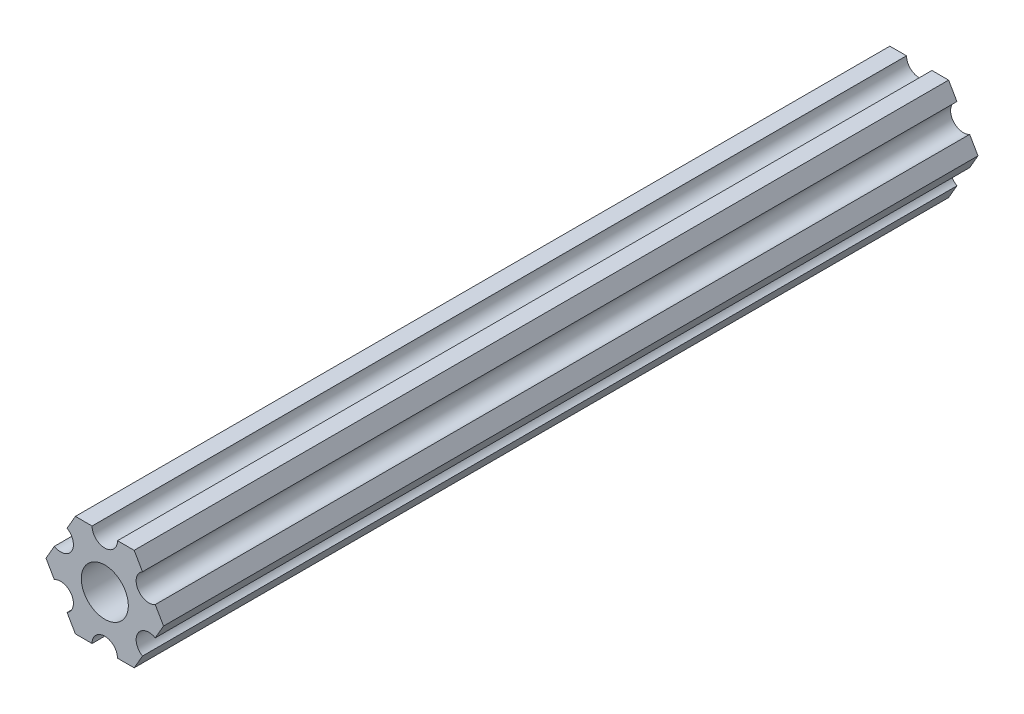
ISO-10303-21;
HEADER;
FILE_DESCRIPTION(('STEP AP214'),'2;1');
FILE_NAME('part.step','',(''),(''),'','','');
FILE_SCHEMA(('AUTOMOTIVE_DESIGN { 1 0 10303 214 1 1 1 1 }'));
ENDSEC;
DATA;
#1=APPLICATION_CONTEXT('core data for automotive mechanical design processes');
#2=APPLICATION_PROTOCOL_DEFINITION('international standard','automotive_design',2000,#1);
#3=PRODUCT_CONTEXT('',#1,'mechanical');
#4=PRODUCT('Part','Part','',(#3));
#5=PRODUCT_RELATED_PRODUCT_CATEGORY('part','',(#4));
#6=PRODUCT_DEFINITION_FORMATION('','',#4);
#7=PRODUCT_DEFINITION_CONTEXT('part definition',#1,'design');
#8=PRODUCT_DEFINITION('design','',#6,#7);
#9=PRODUCT_DEFINITION_SHAPE('','',#8);
#10=(LENGTH_UNIT() NAMED_UNIT(*) SI_UNIT(.MILLI.,.METRE.));
#11=(NAMED_UNIT(*) PLANE_ANGLE_UNIT() SI_UNIT($,.RADIAN.));
#12=(NAMED_UNIT(*) SI_UNIT($,.STERADIAN.) SOLID_ANGLE_UNIT());
#13=UNCERTAINTY_MEASURE_WITH_UNIT(LENGTH_MEASURE(1.E-05),#10,'distance_accuracy_value','');
#14=(GEOMETRIC_REPRESENTATION_CONTEXT(3) GLOBAL_UNCERTAINTY_ASSIGNED_CONTEXT((#13)) GLOBAL_UNIT_ASSIGNED_CONTEXT((#10,
#11,#12)) REPRESENTATION_CONTEXT('',''));
#15=CARTESIAN_POINT('',(0.,0.,0.));
#16=DIRECTION('',(0.,0.,1.));
#17=DIRECTION('',(1.,0.,0.));
#18=AXIS2_PLACEMENT_3D('',#15,#16,#17);
#19=CARTESIAN_POINT('',(5.49926169873049,-3.17500022210629,203.2));
#20=DIRECTION('',(0.,0.,1.));
#21=DIRECTION('',(1.,0.,0.));
#22=AXIS2_PLACEMENT_3D('',#19,#20,#21);
#23=CYLINDRICAL_SURFACE('',#22,1.5875);
#24=CARTESIAN_POINT('',(5.49926169873049,-3.17500022210629,304.8));
#25=DIRECTION('',(0.,0.,-1.));
#26=DIRECTION('',(-1.,0.,0.));
#27=AXIS2_PLACEMENT_3D('',#24,#25,#26);
#28=CIRCLE('',#27,1.5875);
#29=CARTESIAN_POINT('',(4.7055116987305,-4.5498155506141,304.8));
#30=VERTEX_POINT('',#29);
#31=CARTESIAN_POINT('',(6.29301169873047,-1.80018489359848,304.8));
#32=VERTEX_POINT('',#31);
#33=EDGE_CURVE('E190',#30,#32,#28,.T.);
#34=ORIENTED_EDGE('',*,*,#33,.F.);
#35=DIRECTION('',(0.,0.,1.));
#36=VECTOR('',#35,1.);
#37=CARTESIAN_POINT('',(4.7055116987305,-4.5498155506141,203.2));
#38=LINE('',#37,#36);
#39=CARTESIAN_POINT('',(4.7055116987305,-4.5498155506141,203.2));
#40=VERTEX_POINT('',#39);
#41=EDGE_CURVE('E11',#40,#30,#38,.T.);
#42=ORIENTED_EDGE('',*,*,#41,.F.);
#43=CARTESIAN_POINT('',(5.49926169873049,-3.17500022210629,203.2));
#44=DIRECTION('',(0.,0.,-1.));
#45=DIRECTION('',(-1.,0.,0.));
#46=AXIS2_PLACEMENT_3D('',#43,#44,#45);
#47=CIRCLE('',#46,1.5875);
#48=CARTESIAN_POINT('',(6.29301169873047,-1.80018489359848,203.2));
#49=VERTEX_POINT('',#48);
#50=EDGE_CURVE('E241',#40,#49,#47,.T.);
#51=ORIENTED_EDGE('',*,*,#50,.T.);
#52=DIRECTION('',(0.,0.,1.));
#53=VECTOR('',#52,1.);
#54=CARTESIAN_POINT('',(6.29301169873047,-1.80018489359848,203.2));
#55=LINE('',#54,#53);
#56=EDGE_CURVE('E36',#49,#32,#55,.T.);
#57=ORIENTED_EDGE('',*,*,#56,.T.);
#58=EDGE_LOOP('',(#34,#42,#51,#57));
#59=FACE_BOUND('',#58,.T.);
#60=ADVANCED_FACE('F33',(#59),#23,.F.);
#61=CARTESIAN_POINT('',(3.6661745940535,-6.35000022210627,203.2));
#62=DIRECTION('',(0.866025403784446,-0.499999999999988,0.));
#63=DIRECTION('',(0.499999999999988,0.866025403784446,0.));
#64=AXIS2_PLACEMENT_3D('',#61,#62,#63);
#65=PLANE('',#64);
#66=DIRECTION('',(0.499999999999988,0.866025403784446,0.));
#67=VECTOR('',#66,1.);
#68=CARTESIAN_POINT('',(3.6661745940535,-6.35000022210627,304.8));
#69=LINE('',#68,#67);
#70=CARTESIAN_POINT('',(3.6661745940535,-6.35000022210627,304.8));
#71=VERTEX_POINT('',#70);
#72=EDGE_CURVE('E239',#71,#30,#69,.T.);
#73=ORIENTED_EDGE('',*,*,#72,.F.);
#74=DIRECTION('',(0.,0.,1.));
#75=VECTOR('',#74,1.);
#76=CARTESIAN_POINT('',(3.6661745940535,-6.35000022210627,203.2));
#77=LINE('',#76,#75);
#78=CARTESIAN_POINT('',(3.6661745940535,-6.35000022210627,203.2));
#79=VERTEX_POINT('',#78);
#80=EDGE_CURVE('E42',#79,#71,#77,.T.);
#81=ORIENTED_EDGE('',*,*,#80,.F.);
#82=DIRECTION('',(0.499999999999988,0.866025403784446,0.));
#83=VECTOR('',#82,1.);
#84=CARTESIAN_POINT('',(3.6661745940535,-6.35000022210627,203.2));
#85=LINE('',#84,#83);
#86=EDGE_CURVE('E180',#79,#40,#85,.T.);
#87=ORIENTED_EDGE('',*,*,#86,.T.);
#88=ORIENTED_EDGE('',*,*,#41,.T.);
#89=EDGE_LOOP('',(#73,#81,#87,#88));
#90=FACE_BOUND('',#89,.T.);
#91=ADVANCED_FACE('F273',(#90),#65,.T.);
#92=CARTESIAN_POINT('',(1.58750038469929,-6.35000022210627,203.2));
#93=DIRECTION('',(0.,-1.,0.));
#94=DIRECTION('',(0.,0.,-1.));
#95=AXIS2_PLACEMENT_3D('',#92,#93,#94);
#96=PLANE('',#95);
#97=DIRECTION('',(1.,0.,0.));
#98=VECTOR('',#97,1.);
#99=CARTESIAN_POINT('',(1.58750038469929,-6.35000022210627,304.8));
#100=LINE('',#99,#98);
#101=CARTESIAN_POINT('',(1.58750038469929,-6.35000022210627,304.8));
#102=VERTEX_POINT('',#101);
#103=EDGE_CURVE('E167',#102,#71,#100,.T.);
#104=ORIENTED_EDGE('',*,*,#103,.F.);
#105=DIRECTION('',(0.,0.,1.));
#106=VECTOR('',#105,1.);
#107=CARTESIAN_POINT('',(1.58750038469929,-6.35000022210627,203.2));
#108=LINE('',#107,#106);
#109=CARTESIAN_POINT('',(1.58750038469929,-6.35000022210627,203.2));
#110=VERTEX_POINT('',#109);
#111=EDGE_CURVE('E162',#110,#102,#108,.T.);
#112=ORIENTED_EDGE('',*,*,#111,.F.);
#113=DIRECTION('',(1.,0.,0.));
#114=VECTOR('',#113,1.);
#115=CARTESIAN_POINT('',(1.58750038469929,-6.35000022210627,203.2));
#116=LINE('',#115,#114);
#117=EDGE_CURVE('E165',#110,#79,#116,.T.);
#118=ORIENTED_EDGE('',*,*,#117,.T.);
#119=ORIENTED_EDGE('',*,*,#80,.T.);
#120=EDGE_LOOP('',(#104,#112,#118,#119));
#121=FACE_BOUND('',#120,.T.);
#122=ADVANCED_FACE('F164',(#121),#96,.T.);
#123=CARTESIAN_POINT('',(3.84699290671026E-07,-6.35000022210627,203.2));
#124=DIRECTION('',(0.,0.,1.));
#125=DIRECTION('',(1.,0.,0.));
#126=AXIS2_PLACEMENT_3D('',#123,#124,#125);
#127=CYLINDRICAL_SURFACE('',#126,1.5875);
#128=CARTESIAN_POINT('',(3.84699290671026E-07,-6.35000022210627,304.8));
#129=DIRECTION('',(0.,0.,-1.));
#130=DIRECTION('',(-1.,0.,0.));
#131=AXIS2_PLACEMENT_3D('',#128,#129,#130);
#132=CIRCLE('',#131,1.5875);
#133=CARTESIAN_POINT('',(-1.58749961530071,-6.35000022210627,304.8));
#134=VERTEX_POINT('',#133);
#135=EDGE_CURVE('E236',#134,#102,#132,.T.);
#136=ORIENTED_EDGE('',*,*,#135,.F.);
#137=DIRECTION('',(0.,0.,1.));
#138=VECTOR('',#137,1.);
#139=CARTESIAN_POINT('',(-1.58749961530071,-6.35000022210627,203.2));
#140=LINE('',#139,#138);
#141=CARTESIAN_POINT('',(-1.58749961530071,-6.35000022210627,203.2));
#142=VERTEX_POINT('',#141);
#143=EDGE_CURVE('E172',#142,#134,#140,.T.);
#144=ORIENTED_EDGE('',*,*,#143,.F.);
#145=CARTESIAN_POINT('',(3.84699290671026E-07,-6.35000022210627,203.2));
#146=DIRECTION('',(0.,0.,-1.));
#147=DIRECTION('',(-1.,0.,0.));
#148=AXIS2_PLACEMENT_3D('',#145,#146,#147);
#149=CIRCLE('',#148,1.5875);
#150=EDGE_CURVE('E178',#142,#110,#149,.T.);
#151=ORIENTED_EDGE('',*,*,#150,.T.);
#152=ORIENTED_EDGE('',*,*,#111,.T.);
#153=EDGE_LOOP('',(#136,#144,#151,#152));
#154=FACE_BOUND('',#153,.T.);
#155=ADVANCED_FACE('F182',(#154),#127,.F.);
#156=CARTESIAN_POINT('',(-3.66617382465478,-6.35000022210627,203.2));
#157=DIRECTION('',(0.,-1.,0.));
#158=DIRECTION('',(1.,0.,0.));
#159=AXIS2_PLACEMENT_3D('',#156,#157,#158);
#160=PLANE('',#159);
#161=DIRECTION('',(1.,0.,0.));
#162=VECTOR('',#161,1.);
#163=CARTESIAN_POINT('',(-3.66617382465478,-6.35000022210627,304.8));
#164=LINE('',#163,#162);
#165=CARTESIAN_POINT('',(-3.66617382465478,-6.35000022210627,304.8));
#166=VERTEX_POINT('',#165);
#167=EDGE_CURVE('E233',#166,#134,#164,.T.);
#168=ORIENTED_EDGE('',*,*,#167,.F.);
#169=DIRECTION('',(0.,0.,1.));
#170=VECTOR('',#169,1.);
#171=CARTESIAN_POINT('',(-3.66617382465478,-6.35000022210627,203.2));
#172=LINE('',#171,#170);
#173=CARTESIAN_POINT('',(-3.66617382465478,-6.35000022210627,203.2));
#174=VERTEX_POINT('',#173);
#175=EDGE_CURVE('E245',#174,#166,#172,.T.);
#176=ORIENTED_EDGE('',*,*,#175,.F.);
#177=DIRECTION('',(1.,0.,0.));
#178=VECTOR('',#177,1.);
#179=CARTESIAN_POINT('',(-3.66617382465478,-6.35000022210627,203.2));
#180=LINE('',#179,#178);
#181=EDGE_CURVE('E183',#174,#142,#180,.T.);
#182=ORIENTED_EDGE('',*,*,#181,.T.);
#183=ORIENTED_EDGE('',*,*,#143,.T.);
#184=EDGE_LOOP('',(#168,#176,#182,#183));
#185=FACE_BOUND('',#184,.T.);
#186=ADVANCED_FACE('F286',(#185),#160,.T.);
#187=CARTESIAN_POINT('',(-4.70551103839171,-4.54981561357971,203.2));
#188=DIRECTION('',(-0.866025373493149,-0.500000052466048,0.));
#189=DIRECTION('',(0.500000052466048,-0.866025373493149,0.));
#190=AXIS2_PLACEMENT_3D('',#187,#188,#189);
#191=PLANE('',#190);
#192=DIRECTION('',(0.500000052466048,-0.866025373493149,0.));
#193=VECTOR('',#192,1.);
#194=CARTESIAN_POINT('',(-4.70551103839171,-4.54981561357971,304.8));
#195=LINE('',#194,#193);
#196=CARTESIAN_POINT('',(-4.70551103839171,-4.54981561357971,304.8));
#197=VERTEX_POINT('',#196);
#198=EDGE_CURVE('E230',#197,#166,#195,.T.);
#199=ORIENTED_EDGE('',*,*,#198,.F.);
#200=DIRECTION('',(0.,0.,1.));
#201=VECTOR('',#200,1.);
#202=CARTESIAN_POINT('',(-4.70551103839171,-4.54981561357971,203.2));
#203=LINE('',#202,#201);
#204=CARTESIAN_POINT('',(-4.70551103839171,-4.54981561357971,203.2));
#205=VERTEX_POINT('',#204);
#206=EDGE_CURVE('E247',#205,#197,#203,.T.);
#207=ORIENTED_EDGE('',*,*,#206,.F.);
#208=DIRECTION('',(0.500000052466048,-0.866025373493149,0.));
#209=VECTOR('',#208,1.);
#210=CARTESIAN_POINT('',(-4.70551103839171,-4.54981561357971,203.2));
#211=LINE('',#210,#209);
#212=EDGE_CURVE('E185',#205,#174,#211,.T.);
#213=ORIENTED_EDGE('',*,*,#212,.T.);
#214=ORIENTED_EDGE('',*,*,#175,.T.);
#215=EDGE_LOOP('',(#199,#207,#213,#214));
#216=FACE_BOUND('',#215,.T.);
#217=ADVANCED_FACE('F289',(#216),#191,.T.);
#218=CARTESIAN_POINT('',(-5.49926112168156,-3.17500033315934,203.2));
#219=DIRECTION('',(0.,0.,1.));
#220=DIRECTION('',(1.,0.,0.));
#221=AXIS2_PLACEMENT_3D('',#218,#219,#220);
#222=CYLINDRICAL_SURFACE('',#221,1.5875);
#223=CARTESIAN_POINT('',(-5.49926112168156,-3.17500033315934,304.8));
#224=DIRECTION('',(0.,0.,-1.));
#225=DIRECTION('',(-1.,0.,0.));
#226=AXIS2_PLACEMENT_3D('',#223,#224,#225);
#227=CIRCLE('',#226,1.5875);
#228=CARTESIAN_POINT('',(-6.29301120497141,-1.80018505273897,304.8));
#229=VERTEX_POINT('',#228);
#230=EDGE_CURVE('E227',#229,#197,#227,.T.);
#231=ORIENTED_EDGE('',*,*,#230,.F.);
#232=DIRECTION('',(0.,0.,1.));
#233=VECTOR('',#232,1.);
#234=CARTESIAN_POINT('',(-6.29301120497141,-1.80018505273897,203.2));
#235=LINE('',#234,#233);
#236=CARTESIAN_POINT('',(-6.29301120497141,-1.80018505273897,203.2));
#237=VERTEX_POINT('',#236);
#238=EDGE_CURVE('E249',#237,#229,#235,.T.);
#239=ORIENTED_EDGE('',*,*,#238,.F.);
#240=CARTESIAN_POINT('',(-5.49926112168156,-3.17500033315934,203.2));
#241=DIRECTION('',(0.,0.,-1.));
#242=DIRECTION('',(-1.,0.,0.));
#243=AXIS2_PLACEMENT_3D('',#240,#241,#242);
#244=CIRCLE('',#243,1.5875);
#245=EDGE_CURVE('E394',#237,#205,#244,.T.);
#246=ORIENTED_EDGE('',*,*,#245,.T.);
#247=ORIENTED_EDGE('',*,*,#206,.T.);
#248=EDGE_LOOP('',(#231,#239,#246,#247));
#249=FACE_BOUND('',#248,.T.);
#250=ADVANCED_FACE('F293',(#249),#222,.F.);
#251=CARTESIAN_POINT('',(-7.33234841870827,-4.44212523790841E-07,203.2));
#252=DIRECTION('',(-0.866025373493149,-0.500000052466048,0.));
#253=DIRECTION('',(0.500000052466048,-0.866025373493149,0.));
#254=AXIS2_PLACEMENT_3D('',#251,#252,#253);
#255=PLANE('',#254);
#256=DIRECTION('',(0.500000052466048,-0.86602537349315,0.));
#257=VECTOR('',#256,1.);
#258=CARTESIAN_POINT('',(-7.33234841870827,-4.44212523790841E-07,304.8));
#259=LINE('',#258,#257);
#260=CARTESIAN_POINT('',(-7.33234841870827,-4.44212523790841E-07,304.8));
#261=VERTEX_POINT('',#260);
#262=EDGE_CURVE('E224',#261,#229,#259,.T.);
#263=ORIENTED_EDGE('',*,*,#262,.F.);
#264=DIRECTION('',(0.,0.,1.));
#265=VECTOR('',#264,1.);
#266=CARTESIAN_POINT('',(-7.33234841870827,-4.44212523790841E-07,203.2));
#267=LINE('',#266,#265);
#268=CARTESIAN_POINT('',(-7.33234841870827,-4.44212523790841E-07,203.2));
#269=VERTEX_POINT('',#268);
#270=EDGE_CURVE('E251',#269,#261,#267,.T.);
#271=ORIENTED_EDGE('',*,*,#270,.F.);
#272=DIRECTION('',(0.500000052466048,-0.86602537349315,0.));
#273=VECTOR('',#272,1.);
#274=CARTESIAN_POINT('',(-7.33234841870827,-4.44212523790841E-07,203.2));
#275=LINE('',#274,#273);
#276=EDGE_CURVE('E391',#269,#237,#275,.T.);
#277=ORIENTED_EDGE('',*,*,#276,.T.);
#278=ORIENTED_EDGE('',*,*,#238,.T.);
#279=EDGE_LOOP('',(#263,#271,#277,#278));
#280=FACE_BOUND('',#279,.T.);
#281=ADVANCED_FACE('F297',(#280),#255,.T.);
#282=CARTESIAN_POINT('',(-6.29301142309098,1.80018429024547,203.2));
#283=DIRECTION('',(-0.866025434075722,0.499999947533955,0.));
#284=DIRECTION('',(-0.499999947533955,-0.866025434075722,0.));
#285=AXIS2_PLACEMENT_3D('',#282,#283,#284);
#286=PLANE('',#285);
#287=DIRECTION('',(-0.499999947533955,-0.866025434075722,0.));
#288=VECTOR('',#287,1.);
#289=CARTESIAN_POINT('',(-6.29301142309098,1.80018429024547,304.8));
#290=LINE('',#289,#288);
#291=CARTESIAN_POINT('',(-6.29301142309098,1.80018429024546,304.8));
#292=VERTEX_POINT('',#291);
#293=EDGE_CURVE('E221',#292,#261,#290,.T.);
#294=ORIENTED_EDGE('',*,*,#293,.F.);
#295=DIRECTION('',(0.,0.,1.));
#296=VECTOR('',#295,1.);
#297=CARTESIAN_POINT('',(-6.29301142309098,1.80018429024546,203.2));
#298=LINE('',#297,#296);
#299=CARTESIAN_POINT('',(-6.29301142309098,1.80018429024546,203.2));
#300=VERTEX_POINT('',#299);
#301=EDGE_CURVE('E253',#300,#292,#298,.T.);
#302=ORIENTED_EDGE('',*,*,#301,.F.);
#303=DIRECTION('',(-0.499999947533955,-0.866025434075722,0.));
#304=VECTOR('',#303,1.);
#305=CARTESIAN_POINT('',(-6.29301142309098,1.80018429024547,203.2));
#306=LINE('',#305,#304);
#307=EDGE_CURVE('E388',#300,#269,#306,.T.);
#308=ORIENTED_EDGE('',*,*,#307,.T.);
#309=ORIENTED_EDGE('',*,*,#270,.T.);
#310=EDGE_LOOP('',(#294,#302,#308,#309));
#311=FACE_BOUND('',#310,.T.);
#312=ADVANCED_FACE('F301',(#311),#286,.T.);
#313=CARTESIAN_POINT('',(-5.49926150638083,3.17499966684067,203.2));
#314=DIRECTION('',(0.,0.,1.));
#315=DIRECTION('',(1.,0.,0.));
#316=AXIS2_PLACEMENT_3D('',#313,#314,#315);
#317=CYLINDRICAL_SURFACE('',#316,1.5875);
#318=CARTESIAN_POINT('',(-5.49926150638083,3.17499966684067,304.8));
#319=DIRECTION('',(0.,0.,-1.));
#320=DIRECTION('',(-1.,0.,0.));
#321=AXIS2_PLACEMENT_3D('',#318,#319,#320);
#322=CIRCLE('',#321,1.5875);
#323=CARTESIAN_POINT('',(-4.70551158967067,4.54981504343588,304.8));
#324=VERTEX_POINT('',#323);
#325=EDGE_CURVE('E218',#324,#292,#322,.T.);
#326=ORIENTED_EDGE('',*,*,#325,.F.);
#327=DIRECTION('',(0.,0.,1.));
#328=VECTOR('',#327,1.);
#329=CARTESIAN_POINT('',(-4.70551158967067,4.54981504343588,203.2));
#330=LINE('',#329,#328);
#331=CARTESIAN_POINT('',(-4.70551158967067,4.54981504343588,203.2));
#332=VERTEX_POINT('',#331);
#333=EDGE_CURVE('E255',#332,#324,#330,.T.);
#334=ORIENTED_EDGE('',*,*,#333,.F.);
#335=CARTESIAN_POINT('',(-5.49926150638083,3.17499966684067,203.2));
#336=DIRECTION('',(0.,0.,-1.));
#337=DIRECTION('',(-1.,0.,0.));
#338=AXIS2_PLACEMENT_3D('',#335,#336,#337);
#339=CIRCLE('',#338,1.5875);
#340=EDGE_CURVE('E385',#332,#300,#339,.T.);
#341=ORIENTED_EDGE('',*,*,#340,.T.);
#342=ORIENTED_EDGE('',*,*,#301,.T.);
#343=EDGE_LOOP('',(#326,#334,#341,#342));
#344=FACE_BOUND('',#343,.T.);
#345=ADVANCED_FACE('F305',(#344),#317,.F.);
#346=CARTESIAN_POINT('',(-3.66617459405348,6.3499997778937,203.2));
#347=DIRECTION('',(-0.866025434075722,0.499999947533955,0.));
#348=DIRECTION('',(-0.499999947533955,-0.866025434075722,0.));
#349=AXIS2_PLACEMENT_3D('',#346,#347,#348);
#350=PLANE('',#349);
#351=DIRECTION('',(-0.499999947533955,-0.866025434075722,0.));
#352=VECTOR('',#351,1.);
#353=CARTESIAN_POINT('',(-3.66617459405348,6.3499997778937,304.8));
#354=LINE('',#353,#352);
#355=CARTESIAN_POINT('',(-3.66617459405348,6.3499997778937,304.8));
#356=VERTEX_POINT('',#355);
#357=EDGE_CURVE('E215',#356,#324,#354,.T.);
#358=ORIENTED_EDGE('',*,*,#357,.F.);
#359=DIRECTION('',(0.,0.,1.));
#360=VECTOR('',#359,1.);
#361=CARTESIAN_POINT('',(-3.66617459405348,6.3499997778937,203.2));
#362=LINE('',#361,#360);
#363=CARTESIAN_POINT('',(-3.66617459405348,6.3499997778937,203.2));
#364=VERTEX_POINT('',#363);
#365=EDGE_CURVE('E257',#364,#356,#362,.T.);
#366=ORIENTED_EDGE('',*,*,#365,.F.);
#367=DIRECTION('',(-0.499999947533955,-0.866025434075722,0.));
#368=VECTOR('',#367,1.);
#369=CARTESIAN_POINT('',(-3.66617459405348,6.3499997778937,203.2));
#370=LINE('',#369,#368);
#371=EDGE_CURVE('E382',#364,#332,#370,.T.);
#372=ORIENTED_EDGE('',*,*,#371,.T.);
#373=ORIENTED_EDGE('',*,*,#333,.T.);
#374=EDGE_LOOP('',(#358,#366,#372,#373));
#375=FACE_BOUND('',#374,.T.);
#376=ADVANCED_FACE('F309',(#375),#350,.T.);
#377=CARTESIAN_POINT('',(-1.58750038469926,6.3499997778937,203.2));
#378=DIRECTION('',(0.,1.,0.));
#379=DIRECTION('',(0.,0.,1.));
#380=AXIS2_PLACEMENT_3D('',#377,#378,#379);
#381=PLANE('',#380);
#382=DIRECTION('',(-1.,0.,0.));
#383=VECTOR('',#382,1.);
#384=CARTESIAN_POINT('',(-1.58750038469926,6.3499997778937,304.8));
#385=LINE('',#384,#383);
#386=CARTESIAN_POINT('',(-1.58750038469926,6.3499997778937,304.8));
#387=VERTEX_POINT('',#386);
#388=EDGE_CURVE('E212',#387,#356,#385,.T.);
#389=ORIENTED_EDGE('',*,*,#388,.F.);
#390=DIRECTION('',(0.,0.,1.));
#391=VECTOR('',#390,1.);
#392=CARTESIAN_POINT('',(-1.58750038469926,6.3499997778937,203.2));
#393=LINE('',#392,#391);
#394=CARTESIAN_POINT('',(-1.58750038469926,6.3499997778937,203.2));
#395=VERTEX_POINT('',#394);
#396=EDGE_CURVE('E259',#395,#387,#393,.T.);
#397=ORIENTED_EDGE('',*,*,#396,.F.);
#398=DIRECTION('',(-1.,0.,0.));
#399=VECTOR('',#398,1.);
#400=CARTESIAN_POINT('',(-1.58750038469926,6.3499997778937,203.2));
#401=LINE('',#400,#399);
#402=EDGE_CURVE('E379',#395,#364,#401,.T.);
#403=ORIENTED_EDGE('',*,*,#402,.T.);
#404=ORIENTED_EDGE('',*,*,#365,.T.);
#405=EDGE_LOOP('',(#389,#397,#403,#404));
#406=FACE_BOUND('',#405,.T.);
#407=ADVANCED_FACE('F313',(#406),#381,.T.);
#408=CARTESIAN_POINT('',(-3.84699252021695E-07,6.3499997778937,203.2));
#409=DIRECTION('',(0.,0.,1.));
#410=DIRECTION('',(1.,0.,0.));
#411=AXIS2_PLACEMENT_3D('',#408,#409,#410);
#412=CYLINDRICAL_SURFACE('',#411,1.5875);
#413=CARTESIAN_POINT('',(-3.84699252021695E-07,6.3499997778937,304.8));
#414=DIRECTION('',(0.,0.,-1.));
#415=DIRECTION('',(-1.,0.,0.));
#416=AXIS2_PLACEMENT_3D('',#413,#414,#415);
#417=CIRCLE('',#416,1.5875);
#418=CARTESIAN_POINT('',(1.58749961530075,6.3499997778937,304.8));
#419=VERTEX_POINT('',#418);
#420=EDGE_CURVE('E209',#419,#387,#417,.T.);
#421=ORIENTED_EDGE('',*,*,#420,.F.);
#422=DIRECTION('',(0.,0.,1.));
#423=VECTOR('',#422,1.);
#424=CARTESIAN_POINT('',(1.58749961530075,6.3499997778937,203.2));
#425=LINE('',#424,#423);
#426=CARTESIAN_POINT('',(1.58749961530075,6.3499997778937,203.2));
#427=VERTEX_POINT('',#426);
#428=EDGE_CURVE('E261',#427,#419,#425,.T.);
#429=ORIENTED_EDGE('',*,*,#428,.F.);
#430=CARTESIAN_POINT('',(-3.84699252021695E-07,6.3499997778937,203.2));
#431=DIRECTION('',(0.,0.,-1.));
#432=DIRECTION('',(-1.,0.,0.));
#433=AXIS2_PLACEMENT_3D('',#430,#431,#432);
#434=CIRCLE('',#433,1.5875);
#435=EDGE_CURVE('E376',#427,#395,#434,.T.);
#436=ORIENTED_EDGE('',*,*,#435,.T.);
#437=ORIENTED_EDGE('',*,*,#396,.T.);
#438=EDGE_LOOP('',(#421,#429,#436,#437));
#439=FACE_BOUND('',#438,.T.);
#440=ADVANCED_FACE('F317',(#439),#412,.F.);
#441=CARTESIAN_POINT('',(3.66617382465482,6.3499997778937,203.2));
#442=DIRECTION('',(0.,1.,0.));
#443=DIRECTION('',(0.,0.,1.));
#444=AXIS2_PLACEMENT_3D('',#441,#442,#443);
#445=PLANE('',#444);
#446=DIRECTION('',(-1.,0.,0.));
#447=VECTOR('',#446,1.);
#448=CARTESIAN_POINT('',(3.66617382465482,6.3499997778937,304.8));
#449=LINE('',#448,#447);
#450=CARTESIAN_POINT('',(3.66617382465482,6.3499997778937,304.8));
#451=VERTEX_POINT('',#450);
#452=EDGE_CURVE('E206',#451,#419,#449,.T.);
#453=ORIENTED_EDGE('',*,*,#452,.F.);
#454=DIRECTION('',(0.,0.,1.));
#455=VECTOR('',#454,1.);
#456=CARTESIAN_POINT('',(3.66617382465482,6.3499997778937,203.2));
#457=LINE('',#456,#455);
#458=CARTESIAN_POINT('',(3.66617382465482,6.3499997778937,203.2));
#459=VERTEX_POINT('',#458);
#460=EDGE_CURVE('E263',#459,#451,#457,.T.);
#461=ORIENTED_EDGE('',*,*,#460,.F.);
#462=DIRECTION('',(-1.,0.,0.));
#463=VECTOR('',#462,1.);
#464=CARTESIAN_POINT('',(3.66617382465482,6.3499997778937,203.2));
#465=LINE('',#464,#463);
#466=EDGE_CURVE('E373',#459,#427,#465,.T.);
#467=ORIENTED_EDGE('',*,*,#466,.T.);
#468=ORIENTED_EDGE('',*,*,#428,.T.);
#469=EDGE_LOOP('',(#453,#461,#467,#468));
#470=FACE_BOUND('',#469,.T.);
#471=ADVANCED_FACE('F321',(#470),#445,.T.);
#472=CARTESIAN_POINT('',(4.70551118909645,4.54981503427037,203.2));
#473=DIRECTION('',(0.866025358347508,0.500000078699064,0.));
#474=DIRECTION('',(-0.500000078699064,0.866025358347508,0.));
#475=AXIS2_PLACEMENT_3D('',#472,#473,#474);
#476=PLANE('',#475);
#477=DIRECTION('',(-0.500000078699064,0.866025358347508,0.));
#478=VECTOR('',#477,1.);
#479=CARTESIAN_POINT('',(4.70551118909645,4.54981503427037,304.8));
#480=LINE('',#479,#478);
#481=CARTESIAN_POINT('',(4.70551118909645,4.54981503427037,304.8));
#482=VERTEX_POINT('',#481);
#483=EDGE_CURVE('E203',#482,#451,#480,.T.);
#484=ORIENTED_EDGE('',*,*,#483,.F.);
#485=DIRECTION('',(0.,0.,1.));
#486=VECTOR('',#485,1.);
#487=CARTESIAN_POINT('',(4.70551118909645,4.54981503427037,203.2));
#488=LINE('',#487,#486);
#489=CARTESIAN_POINT('',(4.70551118909645,4.54981503427037,203.2));
#490=VERTEX_POINT('',#489);
#491=EDGE_CURVE('E265',#490,#482,#488,.T.);
#492=ORIENTED_EDGE('',*,*,#491,.F.);
#493=DIRECTION('',(-0.500000078699064,0.866025358347508,0.));
#494=VECTOR('',#493,1.);
#495=CARTESIAN_POINT('',(4.70551118909645,4.54981503427037,203.2));
#496=LINE('',#495,#494);
#497=EDGE_CURVE('E370',#490,#459,#496,.T.);
#498=ORIENTED_EDGE('',*,*,#497,.T.);
#499=ORIENTED_EDGE('',*,*,#460,.T.);
#500=EDGE_LOOP('',(#484,#492,#498,#499));
#501=FACE_BOUND('',#500,.T.);
#502=ADVANCED_FACE('F325',(#501),#476,.T.);
#503=CARTESIAN_POINT('',(5.49926131403121,3.1749997778937,203.2));
#504=DIRECTION('',(0.,0.,1.));
#505=DIRECTION('',(1.,0.,0.));
#506=AXIS2_PLACEMENT_3D('',#503,#504,#505);
#507=CYLINDRICAL_SURFACE('',#506,1.5875);
#508=CARTESIAN_POINT('',(5.49926131403121,3.1749997778937,304.8));
#509=DIRECTION('',(0.,0.,-1.));
#510=DIRECTION('',(-1.,0.,0.));
#511=AXIS2_PLACEMENT_3D('',#508,#509,#510);
#512=CIRCLE('',#511,1.5875);
#513=CARTESIAN_POINT('',(6.29301143896598,1.80018452151703,304.8));
#514=VERTEX_POINT('',#513);
#515=EDGE_CURVE('E200',#514,#482,#512,.T.);
#516=ORIENTED_EDGE('',*,*,#515,.F.);
#517=DIRECTION('',(0.,0.,1.));
#518=VECTOR('',#517,1.);
#519=CARTESIAN_POINT('',(6.29301143896598,1.80018452151703,203.2));
#520=LINE('',#519,#518);
#521=CARTESIAN_POINT('',(6.29301143896598,1.80018452151703,203.2));
#522=VERTEX_POINT('',#521);
#523=EDGE_CURVE('E267',#522,#514,#520,.T.);
#524=ORIENTED_EDGE('',*,*,#523,.F.);
#525=CARTESIAN_POINT('',(5.49926131403121,3.1749997778937,203.2));
#526=DIRECTION('',(0.,0.,-1.));
#527=DIRECTION('',(-1.,0.,0.));
#528=AXIS2_PLACEMENT_3D('',#525,#526,#527);
#529=CIRCLE('',#528,1.5875);
#530=EDGE_CURVE('E367',#522,#490,#529,.T.);
#531=ORIENTED_EDGE('',*,*,#530,.T.);
#532=ORIENTED_EDGE('',*,*,#491,.T.);
#533=EDGE_LOOP('',(#516,#524,#531,#532));
#534=FACE_BOUND('',#533,.T.);
#535=ADVANCED_FACE('F329',(#534),#507,.F.);
#536=CARTESIAN_POINT('',(7.33234880340755,-2.22106190273918E-07,203.2));
#537=DIRECTION('',(0.866025358347509,0.500000078699063,0.));
#538=DIRECTION('',(-0.500000078699063,0.866025358347509,0.));
#539=AXIS2_PLACEMENT_3D('',#536,#537,#538);
#540=PLANE('',#539);
#541=DIRECTION('',(-0.500000078699063,0.866025358347509,0.));
#542=VECTOR('',#541,1.);
#543=CARTESIAN_POINT('',(7.33234880340755,-2.22106190273918E-07,304.8));
#544=LINE('',#543,#542);
#545=CARTESIAN_POINT('',(7.33234880340755,-2.22106190273918E-07,304.8));
#546=VERTEX_POINT('',#545);
#547=EDGE_CURVE('E197',#546,#514,#544,.T.);
#548=ORIENTED_EDGE('',*,*,#547,.F.);
#549=DIRECTION('',(0.,0.,1.));
#550=VECTOR('',#549,1.);
#551=CARTESIAN_POINT('',(7.33234880340755,-2.22106190273918E-07,203.2));
#552=LINE('',#551,#550);
#553=CARTESIAN_POINT('',(7.33234880340755,-2.22106190273918E-07,203.2));
#554=VERTEX_POINT('',#553);
#555=EDGE_CURVE('E268',#554,#546,#552,.T.);
#556=ORIENTED_EDGE('',*,*,#555,.F.);
#557=DIRECTION('',(-0.500000078699063,0.866025358347509,0.));
#558=VECTOR('',#557,1.);
#559=CARTESIAN_POINT('',(7.33234880340755,-2.22106190273918E-07,203.2));
#560=LINE('',#559,#558);
#561=EDGE_CURVE('E364',#554,#522,#560,.T.);
#562=ORIENTED_EDGE('',*,*,#561,.T.);
#563=ORIENTED_EDGE('',*,*,#523,.T.);
#564=EDGE_LOOP('',(#548,#556,#562,#563));
#565=FACE_BOUND('',#564,.T.);
#566=ADVANCED_FACE('F333',(#565),#540,.T.);
#567=CARTESIAN_POINT('',(6.29301169873047,-1.80018489359848,203.2));
#568=DIRECTION('',(0.866025403784446,-0.499999999999988,0.));
#569=DIRECTION('',(0.499999999999988,0.866025403784446,0.));
#570=AXIS2_PLACEMENT_3D('',#567,#568,#569);
#571=PLANE('',#570);
#572=DIRECTION('',(0.499999999999988,0.866025403784446,0.));
#573=VECTOR('',#572,1.);
#574=CARTESIAN_POINT('',(6.29301169873047,-1.80018489359848,304.8));
#575=LINE('',#574,#573);
#576=EDGE_CURVE('E193',#32,#546,#575,.T.);
#577=ORIENTED_EDGE('',*,*,#576,.F.);
#578=ORIENTED_EDGE('',*,*,#56,.F.);
#579=DIRECTION('',(0.499999999999988,0.866025403784446,0.));
#580=VECTOR('',#579,1.);
#581=CARTESIAN_POINT('',(6.29301169873047,-1.80018489359848,203.2));
#582=LINE('',#581,#580);
#583=EDGE_CURVE('E362',#49,#554,#582,.T.);
#584=ORIENTED_EDGE('',*,*,#583,.T.);
#585=ORIENTED_EDGE('',*,*,#555,.T.);
#586=EDGE_LOOP('',(#577,#578,#584,#585));
#587=FACE_BOUND('',#586,.T.);
#588=ADVANCED_FACE('F270',(#587),#571,.T.);
#589=CARTESIAN_POINT('',(5.49926169873049,-3.17500022210629,203.2));
#590=DIRECTION('',(0.,0.,-1.));
#591=DIRECTION('',(-1.,0.,0.));
#592=AXIS2_PLACEMENT_3D('',#589,#590,#591);
#593=PLANE('',#592);
#594=CARTESIAN_POINT('',(0.,0.,203.2));
#595=DIRECTION('',(0.,0.,1.));
#596=DIRECTION('',(-1.,0.,0.));
#597=AXIS2_PLACEMENT_3D('',#594,#595,#596);
#598=CIRCLE('',#597,2.9337);
#599=CARTESIAN_POINT('',(-2.9337,0.,203.2));
#600=VERTEX_POINT('',#599);
#601=EDGE_CURVE('E194',#600,#600,#598,.T.);
#602=ORIENTED_EDGE('',*,*,#601,.T.);
#603=EDGE_LOOP('',(#602));
#604=FACE_BOUND('',#603,.T.);
#605=ORIENTED_EDGE('',*,*,#50,.F.);
#606=ORIENTED_EDGE('',*,*,#86,.F.);
#607=ORIENTED_EDGE('',*,*,#117,.F.);
#608=ORIENTED_EDGE('',*,*,#150,.F.);
#609=ORIENTED_EDGE('',*,*,#181,.F.);
#610=ORIENTED_EDGE('',*,*,#212,.F.);
#611=ORIENTED_EDGE('',*,*,#245,.F.);
#612=ORIENTED_EDGE('',*,*,#276,.F.);
#613=ORIENTED_EDGE('',*,*,#307,.F.);
#614=ORIENTED_EDGE('',*,*,#340,.F.);
#615=ORIENTED_EDGE('',*,*,#371,.F.);
#616=ORIENTED_EDGE('',*,*,#402,.F.);
#617=ORIENTED_EDGE('',*,*,#435,.F.);
#618=ORIENTED_EDGE('',*,*,#466,.F.);
#619=ORIENTED_EDGE('',*,*,#497,.F.);
#620=ORIENTED_EDGE('',*,*,#530,.F.);
#621=ORIENTED_EDGE('',*,*,#561,.F.);
#622=ORIENTED_EDGE('',*,*,#583,.F.);
#623=EDGE_LOOP('',(#605,#606,#607,#608,#609,#610,#611,#612,#613,#614,#615,#616,#617,#618,#619,
#620,#621,#622));
#624=FACE_BOUND('',#623,.T.);
#625=ADVANCED_FACE('F176',(#604,#624),#593,.T.);
#626=CARTESIAN_POINT('',(5.49926169873049,-3.17500022210629,304.8));
#627=DIRECTION('',(0.,0.,-1.));
#628=DIRECTION('',(-1.,0.,0.));
#629=AXIS2_PLACEMENT_3D('',#626,#627,#628);
#630=PLANE('',#629);
#631=CARTESIAN_POINT('',(0.,0.,304.8));
#632=DIRECTION('',(0.,0.,1.));
#633=DIRECTION('',(-1.,0.,0.));
#634=AXIS2_PLACEMENT_3D('',#631,#632,#633);
#635=CIRCLE('',#634,2.9337);
#636=CARTESIAN_POINT('',(-2.9337,0.,304.8));
#637=VERTEX_POINT('',#636);
#638=EDGE_CURVE('E357',#637,#637,#635,.T.);
#639=ORIENTED_EDGE('',*,*,#638,.F.);
#640=EDGE_LOOP('',(#639));
#641=FACE_BOUND('',#640,.T.);
#642=ORIENTED_EDGE('',*,*,#33,.T.);
#643=ORIENTED_EDGE('',*,*,#576,.T.);
#644=ORIENTED_EDGE('',*,*,#547,.T.);
#645=ORIENTED_EDGE('',*,*,#515,.T.);
#646=ORIENTED_EDGE('',*,*,#483,.T.);
#647=ORIENTED_EDGE('',*,*,#452,.T.);
#648=ORIENTED_EDGE('',*,*,#420,.T.);
#649=ORIENTED_EDGE('',*,*,#388,.T.);
#650=ORIENTED_EDGE('',*,*,#357,.T.);
#651=ORIENTED_EDGE('',*,*,#325,.T.);
#652=ORIENTED_EDGE('',*,*,#293,.T.);
#653=ORIENTED_EDGE('',*,*,#262,.T.);
#654=ORIENTED_EDGE('',*,*,#230,.T.);
#655=ORIENTED_EDGE('',*,*,#198,.T.);
#656=ORIENTED_EDGE('',*,*,#167,.T.);
#657=ORIENTED_EDGE('',*,*,#135,.T.);
#658=ORIENTED_EDGE('',*,*,#103,.T.);
#659=ORIENTED_EDGE('',*,*,#72,.T.);
#660=EDGE_LOOP('',(#642,#643,#644,#645,#646,#647,#648,#649,#650,#651,#652,#653,#654,#655,#656,
#657,#658,#659));
#661=FACE_BOUND('',#660,.T.);
#662=ADVANCED_FACE('F272',(#641,#661),#630,.F.);
#663=CARTESIAN_POINT('',(0.,0.,203.2));
#664=DIRECTION('',(0.,0.,1.));
#665=DIRECTION('',(1.,0.,0.));
#666=AXIS2_PLACEMENT_3D('',#663,#664,#665);
#667=CYLINDRICAL_SURFACE('',#666,2.9337);
#668=ORIENTED_EDGE('',*,*,#601,.F.);
#669=EDGE_LOOP('',(#668));
#670=FACE_BOUND('',#669,.T.);
#671=ORIENTED_EDGE('',*,*,#638,.T.);
#672=EDGE_LOOP('',(#671));
#673=FACE_BOUND('',#672,.T.);
#674=ADVANCED_FACE('F345',(#670,#673),#667,.F.);
#675=CLOSED_SHELL('',(#60,#91,#122,#155,#186,#217,#250,#281,#312,#345,#376,#407,#440,#471,#502,
#535,#566,#588,#625,#662,#674));
#676=MANIFOLD_SOLID_BREP('B2',#675);
#677=ADVANCED_BREP_SHAPE_REPRESENTATION('',(#18,#676),#14);
#678=SHAPE_DEFINITION_REPRESENTATION(#9,#677);
ENDSEC;
END-ISO-10303-21;
